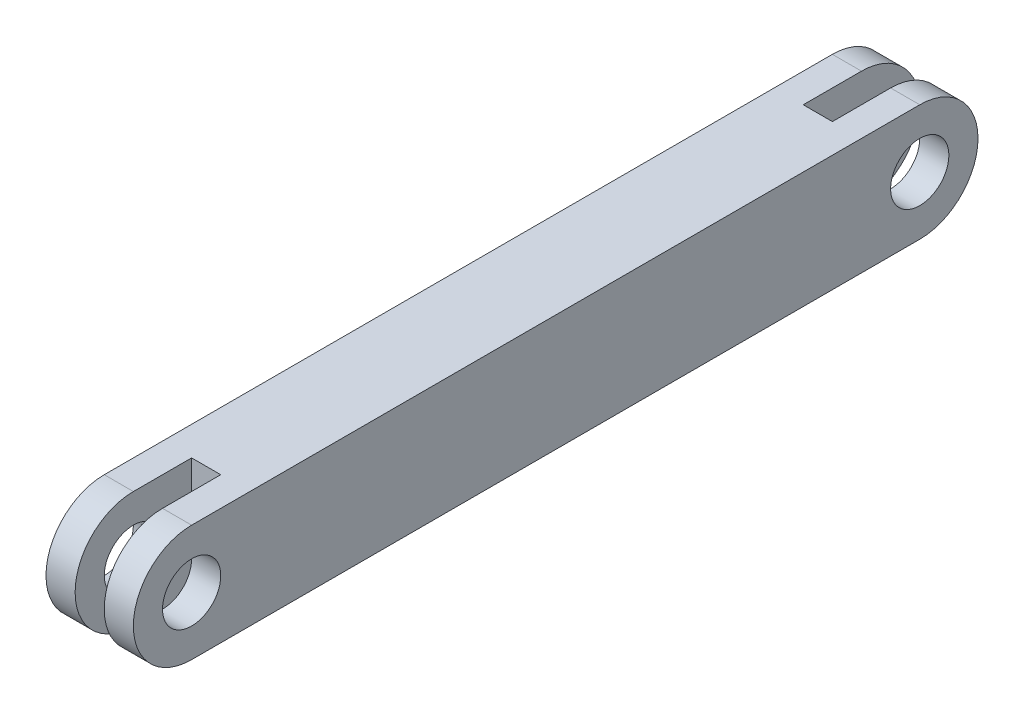
ISO-10303-21;
HEADER;
FILE_DESCRIPTION(('STEP AP214'),'2;1');
FILE_NAME('part.step','',(''),(''),'','','');
FILE_SCHEMA(('AUTOMOTIVE_DESIGN { 1 0 10303 214 1 1 1 1 }'));
ENDSEC;
DATA;
#1=APPLICATION_CONTEXT('core data for automotive mechanical design processes');
#2=APPLICATION_PROTOCOL_DEFINITION('international standard','automotive_design',2000,#1);
#3=PRODUCT_CONTEXT('',#1,'mechanical');
#4=PRODUCT('Part','Part','',(#3));
#5=PRODUCT_RELATED_PRODUCT_CATEGORY('part','',(#4));
#6=PRODUCT_DEFINITION_FORMATION('','',#4);
#7=PRODUCT_DEFINITION_CONTEXT('part definition',#1,'design');
#8=PRODUCT_DEFINITION('design','',#6,#7);
#9=PRODUCT_DEFINITION_SHAPE('','',#8);
#10=(LENGTH_UNIT() NAMED_UNIT(*) SI_UNIT(.MILLI.,.METRE.));
#11=(NAMED_UNIT(*) PLANE_ANGLE_UNIT() SI_UNIT($,.RADIAN.));
#12=(NAMED_UNIT(*) SI_UNIT($,.STERADIAN.) SOLID_ANGLE_UNIT());
#13=UNCERTAINTY_MEASURE_WITH_UNIT(LENGTH_MEASURE(1.E-05),#10,'distance_accuracy_value','');
#14=(GEOMETRIC_REPRESENTATION_CONTEXT(3) GLOBAL_UNCERTAINTY_ASSIGNED_CONTEXT((#13)) GLOBAL_UNIT_ASSIGNED_CONTEXT((#10,
#11,#12)) REPRESENTATION_CONTEXT('',''));
#15=CARTESIAN_POINT('',(0.,0.,0.));
#16=DIRECTION('',(0.,0.,1.));
#17=DIRECTION('',(1.,0.,0.));
#18=AXIS2_PLACEMENT_3D('',#15,#16,#17);
#19=CARTESIAN_POINT('',(130.162143413187,-34.9207351400196,92.075));
#20=DIRECTION('',(1.,0.,0.));
#21=DIRECTION('',(0.,0.,-1.));
#22=AXIS2_PLACEMENT_3D('',#19,#20,#21);
#23=PLANE('',#22);
#24=CARTESIAN_POINT('',(130.162143413187,-28.5707351400196,85.725));
#25=DIRECTION('',(1.00000000000001,0.,0.));
#26=DIRECTION('',(0.,0.,-1.00000000000001));
#27=AXIS2_PLACEMENT_3D('',#24,#25,#26);
#28=CIRCLE('',#27,3.175);
#29=CARTESIAN_POINT('',(130.162143413187,-28.5707351400196,82.55));
#30=VERTEX_POINT('',#29);
#31=EDGE_CURVE('E226',#30,#30,#28,.T.);
#32=ORIENTED_EDGE('',*,*,#31,.T.);
#33=EDGE_LOOP('',(#32));
#34=FACE_BOUND('',#33,.T.);
#35=CARTESIAN_POINT('',(130.162143413187,-28.5707351400196,6.34999999999997));
#36=DIRECTION('',(1.,0.,0.));
#37=DIRECTION('',(0.,0.,-1.));
#38=AXIS2_PLACEMENT_3D('',#35,#36,#37);
#39=CIRCLE('',#38,3.175);
#40=CARTESIAN_POINT('',(130.162143413187,-28.5707351400196,3.17499999999997));
#41=VERTEX_POINT('',#40);
#42=EDGE_CURVE('E220',#41,#41,#39,.T.);
#43=ORIENTED_EDGE('',*,*,#42,.T.);
#44=EDGE_LOOP('',(#43));
#45=FACE_BOUND('',#44,.T.);
#46=DIRECTION('',(0.,0.,-1.));
#47=VECTOR('',#46,1.);
#48=CARTESIAN_POINT('',(130.162143413187,-34.9207351400196,92.075));
#49=LINE('',#48,#47);
#50=CARTESIAN_POINT('',(130.162143413187,-34.9207351400196,85.725));
#51=VERTEX_POINT('',#50);
#52=CARTESIAN_POINT('',(130.162143413187,-34.9207351400196,6.34999999999983));
#53=VERTEX_POINT('',#52);
#54=EDGE_CURVE('E208',#51,#53,#49,.T.);
#55=ORIENTED_EDGE('',*,*,#54,.F.);
#56=CARTESIAN_POINT('',(130.162143413187,-28.5707351400196,85.725));
#57=DIRECTION('',(1.00000000000001,0.,0.));
#58=DIRECTION('',(0.,0.,-1.00000000000001));
#59=AXIS2_PLACEMENT_3D('',#56,#57,#58);
#60=CIRCLE('',#59,6.34999999999999);
#61=CARTESIAN_POINT('',(130.162143413187,-22.2207351400196,85.725));
#62=VERTEX_POINT('',#61);
#63=EDGE_CURVE('E195',#62,#51,#60,.T.);
#64=ORIENTED_EDGE('',*,*,#63,.F.);
#65=DIRECTION('',(0.,0.,-1.));
#66=VECTOR('',#65,1.);
#67=CARTESIAN_POINT('',(130.162143413187,-22.2207351400196,92.075));
#68=LINE('',#67,#66);
#69=CARTESIAN_POINT('',(130.162143413187,-22.2207351400196,6.34999999999994));
#70=VERTEX_POINT('',#69);
#71=EDGE_CURVE('E212',#62,#70,#68,.T.);
#72=ORIENTED_EDGE('',*,*,#71,.T.);
#73=CARTESIAN_POINT('',(130.162143413187,-28.5707351400196,6.34999999999983));
#74=DIRECTION('',(1.,0.,0.));
#75=DIRECTION('',(0.,0.,-1.));
#76=AXIS2_PLACEMENT_3D('',#73,#74,#75);
#77=CIRCLE('',#76,6.35);
#78=EDGE_CURVE('E246',#53,#70,#77,.T.);
#79=ORIENTED_EDGE('',*,*,#78,.F.);
#80=EDGE_LOOP('',(#55,#64,#72,#79));
#81=FACE_BOUND('',#80,.T.);
#82=ADVANCED_FACE('F100',(#34,#45,#81),#23,.F.);
#83=CARTESIAN_POINT('',(139.687143413187,-34.9207351400196,92.075));
#84=DIRECTION('',(-1.,0.,0.));
#85=DIRECTION('',(0.,0.,1.));
#86=AXIS2_PLACEMENT_3D('',#83,#84,#85);
#87=PLANE('',#86);
#88=CARTESIAN_POINT('',(139.687143413187,-28.5707351400196,85.725));
#89=DIRECTION('',(1.00000000000001,0.,0.));
#90=DIRECTION('',(0.,0.,-1.00000000000001));
#91=AXIS2_PLACEMENT_3D('',#88,#89,#90);
#92=CIRCLE('',#91,3.175);
#93=CARTESIAN_POINT('',(139.687143413187,-28.5707351400196,82.55));
#94=VERTEX_POINT('',#93);
#95=EDGE_CURVE('E233',#94,#94,#92,.T.);
#96=ORIENTED_EDGE('',*,*,#95,.F.);
#97=EDGE_LOOP('',(#96));
#98=FACE_BOUND('',#97,.T.);
#99=CARTESIAN_POINT('',(139.687143413187,-28.5707351400196,6.34999999999997));
#100=DIRECTION('',(1.,0.,0.));
#101=DIRECTION('',(0.,0.,-1.));
#102=AXIS2_PLACEMENT_3D('',#99,#100,#101);
#103=CIRCLE('',#102,3.175);
#104=CARTESIAN_POINT('',(139.687143413187,-28.5707351400196,3.17499999999997));
#105=VERTEX_POINT('',#104);
#106=EDGE_CURVE('E253',#105,#105,#103,.T.);
#107=ORIENTED_EDGE('',*,*,#106,.F.);
#108=EDGE_LOOP('',(#107));
#109=FACE_BOUND('',#108,.T.);
#110=CARTESIAN_POINT('',(139.687143413187,-28.5707351400196,85.725));
#111=DIRECTION('',(1.00000000000001,0.,0.));
#112=DIRECTION('',(0.,0.,-1.00000000000001));
#113=AXIS2_PLACEMENT_3D('',#110,#111,#112);
#114=CIRCLE('',#113,6.34999999999999);
#115=CARTESIAN_POINT('',(139.687143413187,-22.2207351400196,85.725));
#116=VERTEX_POINT('',#115);
#117=CARTESIAN_POINT('',(139.687143413187,-34.9207351400196,85.725));
#118=VERTEX_POINT('',#117);
#119=EDGE_CURVE('E188',#116,#118,#114,.T.);
#120=ORIENTED_EDGE('',*,*,#119,.T.);
#121=DIRECTION('',(0.,0.,-1.));
#122=VECTOR('',#121,1.);
#123=CARTESIAN_POINT('',(139.687143413187,-34.9207351400196,92.075));
#124=LINE('',#123,#122);
#125=CARTESIAN_POINT('',(139.687143413187,-34.9207351400196,6.34999999999983));
#126=VERTEX_POINT('',#125);
#127=EDGE_CURVE('E192',#118,#126,#124,.T.);
#128=ORIENTED_EDGE('',*,*,#127,.T.);
#129=CARTESIAN_POINT('',(139.687143413187,-28.5707351400196,6.34999999999983));
#130=DIRECTION('',(1.,0.,0.));
#131=DIRECTION('',(0.,0.,-1.));
#132=AXIS2_PLACEMENT_3D('',#129,#130,#131);
#133=CIRCLE('',#132,6.35);
#134=CARTESIAN_POINT('',(139.687143413187,-22.2207351400196,6.34999999999994));
#135=VERTEX_POINT('',#134);
#136=EDGE_CURVE('E245',#126,#135,#133,.T.);
#137=ORIENTED_EDGE('',*,*,#136,.T.);
#138=DIRECTION('',(0.,0.,-1.));
#139=VECTOR('',#138,1.);
#140=CARTESIAN_POINT('',(139.687143413187,-22.2207351400196,92.075));
#141=LINE('',#140,#139);
#142=EDGE_CURVE('E194',#116,#135,#141,.T.);
#143=ORIENTED_EDGE('',*,*,#142,.F.);
#144=EDGE_LOOP('',(#120,#128,#137,#143));
#145=FACE_BOUND('',#144,.T.);
#146=ADVANCED_FACE('F189',(#98,#109,#145),#87,.F.);
#147=CARTESIAN_POINT('',(133.337143413187,-34.9207351400196,92.075));
#148=DIRECTION('',(-1.,0.,0.));
#149=DIRECTION('',(0.,0.,1.));
#150=AXIS2_PLACEMENT_3D('',#147,#148,#149);
#151=PLANE('',#150);
#152=CARTESIAN_POINT('',(133.337143413187,-28.5707351400196,85.725));
#153=DIRECTION('',(-1.,0.,0.));
#154=DIRECTION('',(0.,0.,1.));
#155=AXIS2_PLACEMENT_3D('',#152,#153,#154);
#156=CIRCLE('',#155,3.175);
#157=CARTESIAN_POINT('',(133.337143413187,-28.5707351400196,88.9));
#158=VERTEX_POINT('',#157);
#159=EDGE_CURVE('E225',#158,#158,#156,.T.);
#160=ORIENTED_EDGE('',*,*,#159,.T.);
#161=EDGE_LOOP('',(#160));
#162=FACE_BOUND('',#161,.T.);
#163=CARTESIAN_POINT('',(133.337143413187,-28.5707351400196,85.725));
#164=DIRECTION('',(-1.,0.,0.));
#165=DIRECTION('',(0.,0.,1.));
#166=AXIS2_PLACEMENT_3D('',#163,#164,#165);
#167=CIRCLE('',#166,6.34999999999999);
#168=CARTESIAN_POINT('',(133.337143413187,-34.9207351400196,85.725));
#169=VERTEX_POINT('',#168);
#170=CARTESIAN_POINT('',(133.337143413187,-22.2207351400196,85.725));
#171=VERTEX_POINT('',#170);
#172=EDGE_CURVE('E238',#169,#171,#167,.T.);
#173=ORIENTED_EDGE('',*,*,#172,.F.);
#174=DIRECTION('',(0.,0.,1.));
#175=VECTOR('',#174,1.);
#176=CARTESIAN_POINT('',(133.337143413187,-34.9207351400196,92.075));
#177=LINE('',#176,#175);
#178=CARTESIAN_POINT('',(133.337143413187,-34.9207351400196,79.375));
#179=VERTEX_POINT('',#178);
#180=EDGE_CURVE('E281',#179,#169,#177,.T.);
#181=ORIENTED_EDGE('',*,*,#180,.F.);
#182=DIRECTION('',(0.,1.,0.));
#183=VECTOR('',#182,1.);
#184=CARTESIAN_POINT('',(133.337143413187,-34.9207351400196,79.375));
#185=LINE('',#184,#183);
#186=CARTESIAN_POINT('',(133.337143413187,-22.2207351400196,79.375));
#187=VERTEX_POINT('',#186);
#188=EDGE_CURVE('E297',#179,#187,#185,.T.);
#189=ORIENTED_EDGE('',*,*,#188,.T.);
#190=DIRECTION('',(0.,0.,1.));
#191=VECTOR('',#190,1.);
#192=CARTESIAN_POINT('',(133.337143413187,-22.2207351400196,92.075));
#193=LINE('',#192,#191);
#194=EDGE_CURVE('E278',#187,#171,#193,.T.);
#195=ORIENTED_EDGE('',*,*,#194,.T.);
#196=EDGE_LOOP('',(#173,#181,#189,#195));
#197=FACE_BOUND('',#196,.T.);
#198=ADVANCED_FACE('F339',(#162,#197),#151,.F.);
#199=CARTESIAN_POINT('',(136.512143413187,-34.9207351400196,92.075));
#200=DIRECTION('',(1.,0.,0.));
#201=DIRECTION('',(0.,0.,-1.));
#202=AXIS2_PLACEMENT_3D('',#199,#200,#201);
#203=PLANE('',#202);
#204=CARTESIAN_POINT('',(136.512143413187,-28.5707351400196,85.725));
#205=DIRECTION('',(1.,0.,0.));
#206=DIRECTION('',(0.,0.,-1.));
#207=AXIS2_PLACEMENT_3D('',#204,#205,#206);
#208=CIRCLE('',#207,3.175);
#209=CARTESIAN_POINT('',(136.512143413187,-28.5707351400196,82.55));
#210=VERTEX_POINT('',#209);
#211=EDGE_CURVE('E223',#210,#210,#208,.T.);
#212=ORIENTED_EDGE('',*,*,#211,.T.);
#213=EDGE_LOOP('',(#212));
#214=FACE_BOUND('',#213,.T.);
#215=DIRECTION('',(0.,0.,-1.));
#216=VECTOR('',#215,1.);
#217=CARTESIAN_POINT('',(136.512143413187,-34.9207351400196,92.075));
#218=LINE('',#217,#216);
#219=CARTESIAN_POINT('',(136.512143413187,-34.9207351400196,85.725));
#220=VERTEX_POINT('',#219);
#221=CARTESIAN_POINT('',(136.512143413187,-34.9207351400196,79.375));
#222=VERTEX_POINT('',#221);
#223=EDGE_CURVE('E284',#220,#222,#218,.T.);
#224=ORIENTED_EDGE('',*,*,#223,.F.);
#225=CARTESIAN_POINT('',(136.512143413187,-28.5707351400196,85.725));
#226=DIRECTION('',(1.,0.,0.));
#227=DIRECTION('',(0.,0.,-1.));
#228=AXIS2_PLACEMENT_3D('',#225,#226,#227);
#229=CIRCLE('',#228,6.34999999999999);
#230=CARTESIAN_POINT('',(136.512143413187,-22.2207351400196,85.725));
#231=VERTEX_POINT('',#230);
#232=EDGE_CURVE('E107',#231,#220,#229,.T.);
#233=ORIENTED_EDGE('',*,*,#232,.F.);
#234=DIRECTION('',(0.,0.,-1.));
#235=VECTOR('',#234,1.);
#236=CARTESIAN_POINT('',(136.512143413187,-22.2207351400196,92.075));
#237=LINE('',#236,#235);
#238=CARTESIAN_POINT('',(136.512143413187,-22.2207351400196,79.375));
#239=VERTEX_POINT('',#238);
#240=EDGE_CURVE('E293',#231,#239,#237,.T.);
#241=ORIENTED_EDGE('',*,*,#240,.T.);
#242=DIRECTION('',(0.,1.,0.));
#243=VECTOR('',#242,1.);
#244=CARTESIAN_POINT('',(136.512143413187,-34.9207351400196,79.375));
#245=LINE('',#244,#243);
#246=EDGE_CURVE('E290',#222,#239,#245,.T.);
#247=ORIENTED_EDGE('',*,*,#246,.F.);
#248=EDGE_LOOP('',(#224,#233,#241,#247));
#249=FACE_BOUND('',#248,.T.);
#250=ADVANCED_FACE('F334',(#214,#249),#203,.F.);
#251=CARTESIAN_POINT('',(130.162143413187,-34.9207351400196,92.075));
#252=DIRECTION('',(0.,1.,0.));
#253=DIRECTION('',(0.,0.,1.));
#254=AXIS2_PLACEMENT_3D('',#251,#252,#253);
#255=PLANE('',#254);
#256=DIRECTION('',(1.,0.,0.));
#257=VECTOR('',#256,1.);
#258=CARTESIAN_POINT('',(130.162143413187,-34.9207351400196,85.725));
#259=LINE('',#258,#257);
#260=EDGE_CURVE('E196',#51,#169,#259,.T.);
#261=ORIENTED_EDGE('',*,*,#260,.F.);
#262=ORIENTED_EDGE('',*,*,#54,.T.);
#263=DIRECTION('',(1.,0.,0.));
#264=VECTOR('',#263,1.);
#265=CARTESIAN_POINT('',(130.162143413187,-34.9207351400196,6.34999999999983));
#266=LINE('',#265,#264);
#267=CARTESIAN_POINT('',(133.337143413187,-34.9207351400196,6.34999999999983));
#268=VERTEX_POINT('',#267);
#269=EDGE_CURVE('E230',#53,#268,#266,.T.);
#270=ORIENTED_EDGE('',*,*,#269,.T.);
#271=DIRECTION('',(0.,0.,1.));
#272=VECTOR('',#271,1.);
#273=CARTESIAN_POINT('',(133.337143413187,-34.9207351400196,12.7));
#274=LINE('',#273,#272);
#275=CARTESIAN_POINT('',(133.337143413187,-34.9207351400196,12.7));
#276=VERTEX_POINT('',#275);
#277=EDGE_CURVE('E261',#268,#276,#274,.T.);
#278=ORIENTED_EDGE('',*,*,#277,.T.);
#279=DIRECTION('',(1.,0.,0.));
#280=VECTOR('',#279,1.);
#281=CARTESIAN_POINT('',(133.337143413187,-34.9207351400196,12.7));
#282=LINE('',#281,#280);
#283=CARTESIAN_POINT('',(136.512143413187,-34.9207351400196,12.7));
#284=VERTEX_POINT('',#283);
#285=EDGE_CURVE('E263',#276,#284,#282,.T.);
#286=ORIENTED_EDGE('',*,*,#285,.T.);
#287=DIRECTION('',(0.,0.,-1.));
#288=VECTOR('',#287,1.);
#289=CARTESIAN_POINT('',(136.512143413187,-34.9207351400196,12.7));
#290=LINE('',#289,#288);
#291=CARTESIAN_POINT('',(136.512143413187,-34.9207351400196,6.34999999999983));
#292=VERTEX_POINT('',#291);
#293=EDGE_CURVE('E267',#284,#292,#290,.T.);
#294=ORIENTED_EDGE('',*,*,#293,.T.);
#295=DIRECTION('',(1.,0.,0.));
#296=VECTOR('',#295,1.);
#297=CARTESIAN_POINT('',(130.162143413187,-34.9207351400197,6.34999999999983));
#298=LINE('',#297,#296);
#299=EDGE_CURVE('E207',#292,#126,#298,.T.);
#300=ORIENTED_EDGE('',*,*,#299,.T.);
#301=ORIENTED_EDGE('',*,*,#127,.F.);
#302=DIRECTION('',(1.,0.,0.));
#303=VECTOR('',#302,1.);
#304=CARTESIAN_POINT('',(130.162143413187,-34.9207351400196,85.725));
#305=LINE('',#304,#303);
#306=EDGE_CURVE('E12',#220,#118,#305,.T.);
#307=ORIENTED_EDGE('',*,*,#306,.F.);
#308=ORIENTED_EDGE('',*,*,#223,.T.);
#309=DIRECTION('',(-1.,0.,0.));
#310=VECTOR('',#309,1.);
#311=CARTESIAN_POINT('',(133.337143413187,-34.9207351400196,79.375));
#312=LINE('',#311,#310);
#313=EDGE_CURVE('E287',#222,#179,#312,.T.);
#314=ORIENTED_EDGE('',*,*,#313,.T.);
#315=ORIENTED_EDGE('',*,*,#180,.T.);
#316=EDGE_LOOP('',(#261,#262,#270,#278,#286,#294,#300,#301,#307,#308,#314,#315));
#317=FACE_BOUND('',#316,.T.);
#318=ADVANCED_FACE('F204',(#317),#255,.F.);
#319=CARTESIAN_POINT('',(133.337143413187,-34.9207351400196,12.7));
#320=DIRECTION('',(-1.,0.,0.));
#321=DIRECTION('',(0.,0.,1.));
#322=AXIS2_PLACEMENT_3D('',#319,#320,#321);
#323=PLANE('',#322);
#324=CARTESIAN_POINT('',(133.337143413187,-28.5707351400196,6.34999999999997));
#325=DIRECTION('',(-1.,0.,0.));
#326=DIRECTION('',(0.,0.,1.));
#327=AXIS2_PLACEMENT_3D('',#324,#325,#326);
#328=CIRCLE('',#327,3.175);
#329=CARTESIAN_POINT('',(133.337143413187,-28.5707351400196,9.52499999999997));
#330=VERTEX_POINT('',#329);
#331=EDGE_CURVE('E219',#330,#330,#328,.T.);
#332=ORIENTED_EDGE('',*,*,#331,.T.);
#333=EDGE_LOOP('',(#332));
#334=FACE_BOUND('',#333,.T.);
#335=ORIENTED_EDGE('',*,*,#277,.F.);
#336=CARTESIAN_POINT('',(133.337143413187,-28.5707351400196,6.34999999999983));
#337=DIRECTION('',(-1.,0.,0.));
#338=DIRECTION('',(0.,0.,1.));
#339=AXIS2_PLACEMENT_3D('',#336,#337,#338);
#340=CIRCLE('',#339,6.35);
#341=CARTESIAN_POINT('',(133.337143413187,-22.2207351400196,6.34999999999994));
#342=VERTEX_POINT('',#341);
#343=EDGE_CURVE('E251',#342,#268,#340,.T.);
#344=ORIENTED_EDGE('',*,*,#343,.F.);
#345=DIRECTION('',(0.,0.,1.));
#346=VECTOR('',#345,1.);
#347=CARTESIAN_POINT('',(133.337143413187,-22.2207351400196,12.7));
#348=LINE('',#347,#346);
#349=CARTESIAN_POINT('',(133.337143413187,-22.2207351400196,12.7));
#350=VERTEX_POINT('',#349);
#351=EDGE_CURVE('E260',#342,#350,#348,.T.);
#352=ORIENTED_EDGE('',*,*,#351,.T.);
#353=DIRECTION('',(0.,1.,0.));
#354=VECTOR('',#353,1.);
#355=CARTESIAN_POINT('',(133.337143413187,-34.9207351400196,12.7));
#356=LINE('',#355,#354);
#357=EDGE_CURVE('E269',#276,#350,#356,.T.);
#358=ORIENTED_EDGE('',*,*,#357,.F.);
#359=EDGE_LOOP('',(#335,#344,#352,#358));
#360=FACE_BOUND('',#359,.T.);
#361=ADVANCED_FACE('F316',(#334,#360),#323,.F.);
#362=CARTESIAN_POINT('',(136.512143413187,-34.9207351400196,12.7));
#363=DIRECTION('',(1.,0.,0.));
#364=DIRECTION('',(0.,0.,-1.));
#365=AXIS2_PLACEMENT_3D('',#362,#363,#364);
#366=PLANE('',#365);
#367=CARTESIAN_POINT('',(136.512143413187,-28.5707351400196,6.34999999999997));
#368=DIRECTION('',(1.,0.,0.));
#369=DIRECTION('',(0.,0.,-1.));
#370=AXIS2_PLACEMENT_3D('',#367,#368,#369);
#371=CIRCLE('',#370,3.175);
#372=CARTESIAN_POINT('',(136.512143413187,-28.5707351400196,3.17499999999997));
#373=VERTEX_POINT('',#372);
#374=EDGE_CURVE('E216',#373,#373,#371,.T.);
#375=ORIENTED_EDGE('',*,*,#374,.T.);
#376=EDGE_LOOP('',(#375));
#377=FACE_BOUND('',#376,.T.);
#378=CARTESIAN_POINT('',(136.512143413187,-28.5707351400196,6.34999999999983));
#379=DIRECTION('',(1.,0.,0.));
#380=DIRECTION('',(0.,0.,-1.));
#381=AXIS2_PLACEMENT_3D('',#378,#379,#380);
#382=CIRCLE('',#381,6.35);
#383=CARTESIAN_POINT('',(136.512143413187,-22.2207351400196,6.34999999999994));
#384=VERTEX_POINT('',#383);
#385=EDGE_CURVE('E210',#292,#384,#382,.T.);
#386=ORIENTED_EDGE('',*,*,#385,.F.);
#387=ORIENTED_EDGE('',*,*,#293,.F.);
#388=DIRECTION('',(0.,1.,0.));
#389=VECTOR('',#388,1.);
#390=CARTESIAN_POINT('',(136.512143413187,-34.9207351400196,12.7));
#391=LINE('',#390,#389);
#392=CARTESIAN_POINT('',(136.512143413187,-22.2207351400196,12.7));
#393=VERTEX_POINT('',#392);
#394=EDGE_CURVE('E276',#284,#393,#391,.T.);
#395=ORIENTED_EDGE('',*,*,#394,.T.);
#396=DIRECTION('',(0.,0.,-1.));
#397=VECTOR('',#396,1.);
#398=CARTESIAN_POINT('',(136.512143413187,-22.2207351400196,12.7));
#399=LINE('',#398,#397);
#400=EDGE_CURVE('E264',#393,#384,#399,.T.);
#401=ORIENTED_EDGE('',*,*,#400,.T.);
#402=EDGE_LOOP('',(#386,#387,#395,#401));
#403=FACE_BOUND('',#402,.T.);
#404=ADVANCED_FACE('F366',(#377,#403),#366,.F.);
#405=CARTESIAN_POINT('',(130.162143413187,-22.2207351400196,92.075));
#406=DIRECTION('',(0.,-1.,0.));
#407=DIRECTION('',(0.,0.,-1.));
#408=AXIS2_PLACEMENT_3D('',#405,#406,#407);
#409=PLANE('',#408);
#410=ORIENTED_EDGE('',*,*,#71,.F.);
#411=DIRECTION('',(1.,0.,0.));
#412=VECTOR('',#411,1.);
#413=CARTESIAN_POINT('',(130.162143413187,-22.2207351400196,85.725));
#414=LINE('',#413,#412);
#415=EDGE_CURVE('E326',#62,#171,#414,.T.);
#416=ORIENTED_EDGE('',*,*,#415,.T.);
#417=ORIENTED_EDGE('',*,*,#194,.F.);
#418=DIRECTION('',(-1.,0.,0.));
#419=VECTOR('',#418,1.);
#420=CARTESIAN_POINT('',(133.337143413187,-22.2207351400196,79.375));
#421=LINE('',#420,#419);
#422=EDGE_CURVE('E285',#239,#187,#421,.T.);
#423=ORIENTED_EDGE('',*,*,#422,.F.);
#424=ORIENTED_EDGE('',*,*,#240,.F.);
#425=EDGE_CURVE('E114',#231,#116,#414,.T.);
#426=ORIENTED_EDGE('',*,*,#425,.T.);
#427=ORIENTED_EDGE('',*,*,#142,.T.);
#428=DIRECTION('',(1.,0.,0.));
#429=VECTOR('',#428,1.);
#430=CARTESIAN_POINT('',(130.162143413187,-22.2207351400196,6.34999999999994));
#431=LINE('',#430,#429);
#432=EDGE_CURVE('E248',#384,#135,#431,.T.);
#433=ORIENTED_EDGE('',*,*,#432,.F.);
#434=ORIENTED_EDGE('',*,*,#400,.F.);
#435=DIRECTION('',(1.,0.,0.));
#436=VECTOR('',#435,1.);
#437=CARTESIAN_POINT('',(133.337143413187,-22.2207351400196,12.7));
#438=LINE('',#437,#436);
#439=EDGE_CURVE('E271',#350,#393,#438,.T.);
#440=ORIENTED_EDGE('',*,*,#439,.F.);
#441=ORIENTED_EDGE('',*,*,#351,.F.);
#442=EDGE_CURVE('E122',#70,#342,#431,.T.);
#443=ORIENTED_EDGE('',*,*,#442,.F.);
#444=EDGE_LOOP('',(#410,#416,#417,#423,#424,#426,#427,#433,#434,#440,#441,#443));
#445=FACE_BOUND('',#444,.T.);
#446=ADVANCED_FACE('F310',(#445),#409,.F.);
#447=CARTESIAN_POINT('',(133.337143413187,-34.9207351400196,79.375));
#448=DIRECTION('',(0.,0.,-1.));
#449=DIRECTION('',(-1.,0.,0.));
#450=AXIS2_PLACEMENT_3D('',#447,#448,#449);
#451=PLANE('',#450);
#452=ORIENTED_EDGE('',*,*,#422,.T.);
#453=ORIENTED_EDGE('',*,*,#188,.F.);
#454=ORIENTED_EDGE('',*,*,#313,.F.);
#455=ORIENTED_EDGE('',*,*,#246,.T.);
#456=EDGE_LOOP('',(#452,#453,#454,#455));
#457=FACE_BOUND('',#456,.T.);
#458=ADVANCED_FACE('F337',(#457),#451,.F.);
#459=CARTESIAN_POINT('',(133.337143413187,-34.9207351400196,12.7));
#460=DIRECTION('',(0.,0.,1.));
#461=DIRECTION('',(1.,0.,0.));
#462=AXIS2_PLACEMENT_3D('',#459,#460,#461);
#463=PLANE('',#462);
#464=ORIENTED_EDGE('',*,*,#439,.T.);
#465=ORIENTED_EDGE('',*,*,#394,.F.);
#466=ORIENTED_EDGE('',*,*,#285,.F.);
#467=ORIENTED_EDGE('',*,*,#357,.T.);
#468=EDGE_LOOP('',(#464,#465,#466,#467));
#469=FACE_BOUND('',#468,.T.);
#470=ADVANCED_FACE('F319',(#469),#463,.F.);
#471=CARTESIAN_POINT('',(130.162143413187,-28.5707351400196,6.34999999999997));
#472=DIRECTION('',(1.,0.,0.));
#473=DIRECTION('',(0.,0.,-1.));
#474=AXIS2_PLACEMENT_3D('',#471,#472,#473);
#475=CYLINDRICAL_SURFACE('',#474,3.175);
#476=ORIENTED_EDGE('',*,*,#106,.T.);
#477=EDGE_LOOP('',(#476));
#478=FACE_BOUND('',#477,.T.);
#479=ORIENTED_EDGE('',*,*,#374,.F.);
#480=EDGE_LOOP('',(#479));
#481=FACE_BOUND('',#480,.T.);
#482=ADVANCED_FACE('F361',(#478,#481),#475,.F.);
#483=ORIENTED_EDGE('',*,*,#42,.F.);
#484=EDGE_LOOP('',(#483));
#485=FACE_BOUND('',#484,.T.);
#486=ORIENTED_EDGE('',*,*,#331,.F.);
#487=EDGE_LOOP('',(#486));
#488=FACE_BOUND('',#487,.T.);
#489=ADVANCED_FACE('F357',(#485,#488),#475,.F.);
#490=CARTESIAN_POINT('',(130.162143413187,-28.5707351400196,6.34999999999983));
#491=DIRECTION('',(1.,0.,0.));
#492=DIRECTION('',(0.,0.,-1.));
#493=AXIS2_PLACEMENT_3D('',#490,#491,#492);
#494=CYLINDRICAL_SURFACE('',#493,6.35);
#495=ORIENTED_EDGE('',*,*,#385,.T.);
#496=ORIENTED_EDGE('',*,*,#432,.T.);
#497=ORIENTED_EDGE('',*,*,#136,.F.);
#498=ORIENTED_EDGE('',*,*,#299,.F.);
#499=EDGE_LOOP('',(#495,#496,#497,#498));
#500=FACE_BOUND('',#499,.T.);
#501=ADVANCED_FACE('F360',(#500),#494,.T.);
#502=ORIENTED_EDGE('',*,*,#343,.T.);
#503=ORIENTED_EDGE('',*,*,#269,.F.);
#504=ORIENTED_EDGE('',*,*,#78,.T.);
#505=ORIENTED_EDGE('',*,*,#442,.T.);
#506=EDGE_LOOP('',(#502,#503,#504,#505));
#507=FACE_BOUND('',#506,.T.);
#508=ADVANCED_FACE('F308',(#507),#494,.T.);
#509=CARTESIAN_POINT('',(130.162143413187,-28.5707351400196,85.725));
#510=DIRECTION('',(1.,0.,0.));
#511=DIRECTION('',(0.,0.,-1.));
#512=AXIS2_PLACEMENT_3D('',#509,#510,#511);
#513=CYLINDRICAL_SURFACE('',#512,3.175);
#514=ORIENTED_EDGE('',*,*,#95,.T.);
#515=EDGE_LOOP('',(#514));
#516=FACE_BOUND('',#515,.T.);
#517=ORIENTED_EDGE('',*,*,#211,.F.);
#518=EDGE_LOOP('',(#517));
#519=FACE_BOUND('',#518,.T.);
#520=ADVANCED_FACE('F420',(#516,#519),#513,.F.);
#521=ORIENTED_EDGE('',*,*,#31,.F.);
#522=EDGE_LOOP('',(#521));
#523=FACE_BOUND('',#522,.T.);
#524=ORIENTED_EDGE('',*,*,#159,.F.);
#525=EDGE_LOOP('',(#524));
#526=FACE_BOUND('',#525,.T.);
#527=ADVANCED_FACE('F346',(#523,#526),#513,.F.);
#528=CARTESIAN_POINT('',(130.162143413187,-28.5707351400196,85.725));
#529=DIRECTION('',(1.,0.,0.));
#530=DIRECTION('',(0.,0.,-1.));
#531=AXIS2_PLACEMENT_3D('',#528,#529,#530);
#532=CYLINDRICAL_SURFACE('',#531,6.34999999999999);
#533=ORIENTED_EDGE('',*,*,#232,.T.);
#534=ORIENTED_EDGE('',*,*,#306,.T.);
#535=ORIENTED_EDGE('',*,*,#119,.F.);
#536=ORIENTED_EDGE('',*,*,#425,.F.);
#537=EDGE_LOOP('',(#533,#534,#535,#536));
#538=FACE_BOUND('',#537,.T.);
#539=ADVANCED_FACE('F199',(#538),#532,.T.);
#540=ORIENTED_EDGE('',*,*,#172,.T.);
#541=ORIENTED_EDGE('',*,*,#415,.F.);
#542=ORIENTED_EDGE('',*,*,#63,.T.);
#543=ORIENTED_EDGE('',*,*,#260,.T.);
#544=EDGE_LOOP('',(#540,#541,#542,#543));
#545=FACE_BOUND('',#544,.T.);
#546=ADVANCED_FACE('F340',(#545),#532,.T.);
#547=CLOSED_SHELL('',(#82,#146,#198,#250,#318,#361,#404,#446,#458,#470,#482,#489,#501,#508,#520,
#527,#539,#546));
#548=MANIFOLD_SOLID_BREP('B2',#547);
#549=ADVANCED_BREP_SHAPE_REPRESENTATION('',(#18,#548),#14);
#550=SHAPE_DEFINITION_REPRESENTATION(#9,#549);
ENDSEC;
END-ISO-10303-21;
